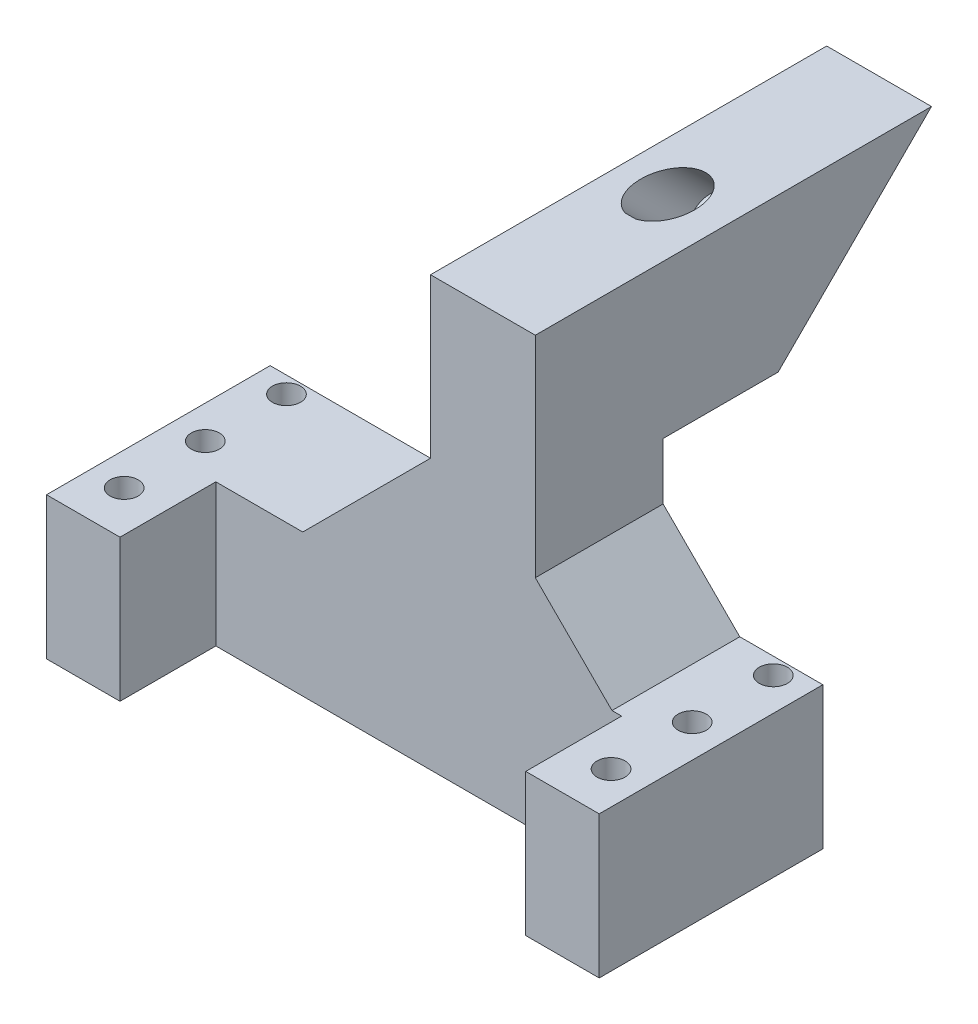
ISO-10303-21;
HEADER;
FILE_DESCRIPTION(('STEP AP214'),'2;1');
FILE_NAME('part.step','',(''),(''),'','','');
FILE_SCHEMA(('AUTOMOTIVE_DESIGN { 1 0 10303 214 1 1 1 1 }'));
ENDSEC;
DATA;
#1=APPLICATION_CONTEXT('core data for automotive mechanical design processes');
#2=APPLICATION_PROTOCOL_DEFINITION('international standard','automotive_design',2000,#1);
#3=PRODUCT_CONTEXT('',#1,'mechanical');
#4=PRODUCT('Part','Part','',(#3));
#5=PRODUCT_RELATED_PRODUCT_CATEGORY('part','',(#4));
#6=PRODUCT_DEFINITION_FORMATION('','',#4);
#7=PRODUCT_DEFINITION_CONTEXT('part definition',#1,'design');
#8=PRODUCT_DEFINITION('design','',#6,#7);
#9=PRODUCT_DEFINITION_SHAPE('','',#8);
#10=(LENGTH_UNIT() NAMED_UNIT(*) SI_UNIT(.MILLI.,.METRE.));
#11=(NAMED_UNIT(*) PLANE_ANGLE_UNIT() SI_UNIT($,.RADIAN.));
#12=(NAMED_UNIT(*) SI_UNIT($,.STERADIAN.) SOLID_ANGLE_UNIT());
#13=UNCERTAINTY_MEASURE_WITH_UNIT(LENGTH_MEASURE(1.E-05),#10,'distance_accuracy_value','');
#14=(GEOMETRIC_REPRESENTATION_CONTEXT(3) GLOBAL_UNCERTAINTY_ASSIGNED_CONTEXT((#13)) GLOBAL_UNIT_ASSIGNED_CONTEXT((#10,
#11,#12)) REPRESENTATION_CONTEXT('',''));
#15=CARTESIAN_POINT('',(0.,0.,0.));
#16=DIRECTION('',(0.,0.,1.));
#17=DIRECTION('',(1.,0.,0.));
#18=AXIS2_PLACEMENT_3D('',#15,#16,#17);
#19=CARTESIAN_POINT('',(52.7780874881676,78.2150216048556,-4.72002160485578));
#20=DIRECTION('',(0.,-0.707106781186551,-0.707106781186544));
#21=DIRECTION('',(0.,0.707106781186544,-0.707106781186551));
#22=AXIS2_PLACEMENT_3D('',#19,#20,#21);
#23=CYLINDRICAL_SURFACE('',#22,2.35);
#24=CARTESIAN_POINT('',(52.7780874881676,39.7150216048555,-43.2200216048555));
#25=DIRECTION('',(0.,-0.707106781186551,-0.707106781186544));
#26=DIRECTION('',(0.,0.707106781186544,-0.707106781186551));
#27=AXIS2_PLACEMENT_3D('',#24,#25,#26);
#28=CIRCLE('',#27,2.35);
#29=CARTESIAN_POINT('',(52.7780874881676,41.3767225406438,-44.8817225406439));
#30=VERTEX_POINT('',#29);
#31=EDGE_CURVE('E190',#30,#30,#28,.T.);
#32=ORIENTED_EDGE('',*,*,#31,.T.);
#33=EDGE_LOOP('',(#32));
#34=FACE_BOUND('',#33,.T.);
#35=CARTESIAN_POINT('',(52.7780874881676,47.6035238597932,-35.3315193499179));
#36=DIRECTION('',(0.,0.707106781186546,0.707106781186549));
#37=DIRECTION('',(0.,-0.707106781186549,0.707106781186546));
#38=AXIS2_PLACEMENT_3D('',#35,#36,#37);
#39=CIRCLE('',#38,2.35);
#40=CARTESIAN_POINT('',(52.7780874881676,45.9418229240048,-33.6698184141295));
#41=VERTEX_POINT('',#40);
#42=EDGE_CURVE('E194',#41,#41,#39,.F.);
#43=ORIENTED_EDGE('',*,*,#42,.F.);
#44=EDGE_LOOP('',(#43));
#45=FACE_BOUND('',#44,.T.);
#46=ADVANCED_FACE('F32',(#34,#45),#23,.F.);
#47=CARTESIAN_POINT('',(11.5,-11.125,-17.5));
#48=DIRECTION('',(0.,0.,1.));
#49=DIRECTION('',(1.,0.,0.));
#50=AXIS2_PLACEMENT_3D('',#47,#48,#49);
#51=PLANE('',#50);
#52=DIRECTION('',(-1.,0.,0.));
#53=VECTOR('',#52,1.);
#54=CARTESIAN_POINT('',(61.5,31.995,-17.5));
#55=LINE('',#54,#53);
#56=CARTESIAN_POINT('',(61.5,31.995,-17.5));
#57=VERTEX_POINT('',#56);
#58=CARTESIAN_POINT('',(45.1,31.995,-17.5));
#59=VERTEX_POINT('',#58);
#60=EDGE_CURVE('E54',#57,#59,#55,.T.);
#61=ORIENTED_EDGE('',*,*,#60,.F.);
#62=DIRECTION('',(0.,1.,0.));
#63=VECTOR('',#62,1.);
#64=CARTESIAN_POINT('',(61.5,-11.125,-17.5));
#65=LINE('',#64,#63);
#66=CARTESIAN_POINT('',(61.5,23.125,-17.5));
#67=VERTEX_POINT('',#66);
#68=EDGE_CURVE('E266',#67,#57,#65,.T.);
#69=ORIENTED_EDGE('',*,*,#68,.F.);
#70=DIRECTION('',(0.707106781186552,-0.707106781186543,0.));
#71=VECTOR('',#70,1.);
#72=CARTESIAN_POINT('',(53.6249999999997,31.0000000000002,-17.5));
#73=LINE('',#72,#71);
#74=CARTESIAN_POINT('',(73.5000000000001,11.125,-17.5));
#75=VERTEX_POINT('',#74);
#76=EDGE_CURVE('E152',#67,#75,#73,.T.);
#77=ORIENTED_EDGE('',*,*,#76,.T.);
#78=DIRECTION('',(-1.,0.,0.));
#79=VECTOR('',#78,1.);
#80=CARTESIAN_POINT('',(76.5,11.125,-17.5));
#81=LINE('',#80,#79);
#82=CARTESIAN_POINT('',(86.5,11.125,-17.5));
#83=VERTEX_POINT('',#82);
#84=EDGE_CURVE('E176',#83,#75,#81,.T.);
#85=ORIENTED_EDGE('',*,*,#84,.F.);
#86=DIRECTION('',(0.,1.,0.));
#87=VECTOR('',#86,1.);
#88=CARTESIAN_POINT('',(86.5,-11.125,-17.5));
#89=LINE('',#88,#87);
#90=CARTESIAN_POINT('',(86.5,-11.125,-17.5));
#91=VERTEX_POINT('',#90);
#92=EDGE_CURVE('E214',#91,#83,#89,.T.);
#93=ORIENTED_EDGE('',*,*,#92,.F.);
#94=DIRECTION('',(-1.,0.,0.));
#95=VECTOR('',#94,1.);
#96=CARTESIAN_POINT('',(11.5,-11.125,-17.5));
#97=LINE('',#96,#95);
#98=CARTESIAN_POINT('',(0.,-11.125,-17.5));
#99=VERTEX_POINT('',#98);
#100=EDGE_CURVE('E295',#91,#99,#97,.T.);
#101=ORIENTED_EDGE('',*,*,#100,.T.);
#102=DIRECTION('',(0.,1.,0.));
#103=VECTOR('',#102,1.);
#104=CARTESIAN_POINT('',(0.,-11.125,-17.5));
#105=LINE('',#104,#103);
#106=CARTESIAN_POINT('',(0.,11.125,-17.5));
#107=VERTEX_POINT('',#106);
#108=EDGE_CURVE('E284',#99,#107,#105,.T.);
#109=ORIENTED_EDGE('',*,*,#108,.T.);
#110=DIRECTION('',(-1.,0.,0.));
#111=VECTOR('',#110,1.);
#112=CARTESIAN_POINT('',(11.5,11.125,-17.5));
#113=LINE('',#112,#111);
#114=CARTESIAN_POINT('',(25.1000000000001,11.125,-17.5));
#115=VERTEX_POINT('',#114);
#116=EDGE_CURVE('E311',#115,#107,#113,.T.);
#117=ORIENTED_EDGE('',*,*,#116,.F.);
#118=DIRECTION('',(-0.707106781186544,-0.707106781186551,0.));
#119=VECTOR('',#118,1.);
#120=CARTESIAN_POINT('',(7.17500000000012,-6.80000000000017,-17.5));
#121=LINE('',#120,#119);
#122=CARTESIAN_POINT('',(45.1,31.1250000000001,-17.5));
#123=VERTEX_POINT('',#122);
#124=EDGE_CURVE('E326',#115,#123,#121,.F.);
#125=ORIENTED_EDGE('',*,*,#124,.T.);
#126=DIRECTION('',(0.,-1.,0.));
#127=VECTOR('',#126,1.);
#128=CARTESIAN_POINT('',(45.1,55.995,-17.5));
#129=LINE('',#128,#127);
#130=EDGE_CURVE('E261',#59,#123,#129,.T.);
#131=ORIENTED_EDGE('',*,*,#130,.F.);
#132=EDGE_LOOP('',(#61,#69,#77,#85,#93,#101,#109,#117,#125,#131));
#133=FACE_BOUND('',#132,.T.);
#134=ADVANCED_FACE('F358',(#133),#51,.F.);
#135=CARTESIAN_POINT('',(61.5,11.125,2.5));
#136=DIRECTION('',(0.,0.,-1.));
#137=DIRECTION('',(0.,1.,0.));
#138=AXIS2_PLACEMENT_3D('',#135,#136,#137);
#139=PLANE('',#138);
#140=DIRECTION('',(0.,-1.,0.));
#141=VECTOR('',#140,1.);
#142=CARTESIAN_POINT('',(75.,11.125,2.5));
#143=LINE('',#142,#141);
#144=CARTESIAN_POINT('',(75.,11.125,2.5));
#145=VERTEX_POINT('',#144);
#146=CARTESIAN_POINT('',(75.,-11.125,2.5));
#147=VERTEX_POINT('',#146);
#148=EDGE_CURVE('E248',#145,#147,#143,.T.);
#149=ORIENTED_EDGE('',*,*,#148,.F.);
#150=DIRECTION('',(-1.,0.,0.));
#151=VECTOR('',#150,1.);
#152=CARTESIAN_POINT('',(76.5,11.125,2.5));
#153=LINE('',#152,#151);
#154=CARTESIAN_POINT('',(73.5000000000001,11.125,2.5));
#155=VERTEX_POINT('',#154);
#156=EDGE_CURVE('E251',#145,#155,#153,.T.);
#157=ORIENTED_EDGE('',*,*,#156,.T.);
#158=DIRECTION('',(-0.707106781186552,0.707106781186543,0.));
#159=VECTOR('',#158,1.);
#160=CARTESIAN_POINT('',(67.5,17.125,2.5));
#161=LINE('',#160,#159);
#162=CARTESIAN_POINT('',(61.5,23.125,2.5));
#163=VERTEX_POINT('',#162);
#164=EDGE_CURVE('E334',#155,#163,#161,.T.);
#165=ORIENTED_EDGE('',*,*,#164,.T.);
#166=DIRECTION('',(0.,-1.,0.));
#167=VECTOR('',#166,1.);
#168=CARTESIAN_POINT('',(61.5,11.125,2.5));
#169=LINE('',#168,#167);
#170=CARTESIAN_POINT('',(61.5,55.995,2.5));
#171=VERTEX_POINT('',#170);
#172=EDGE_CURVE('E264',#171,#163,#169,.T.);
#173=ORIENTED_EDGE('',*,*,#172,.F.);
#174=DIRECTION('',(1.,0.,0.));
#175=VECTOR('',#174,1.);
#176=CARTESIAN_POINT('',(45.1,55.995,2.5));
#177=LINE('',#176,#175);
#178=CARTESIAN_POINT('',(45.1,55.995,2.5));
#179=VERTEX_POINT('',#178);
#180=EDGE_CURVE('E171',#179,#171,#177,.T.);
#181=ORIENTED_EDGE('',*,*,#180,.F.);
#182=DIRECTION('',(0.,-1.,0.));
#183=VECTOR('',#182,1.);
#184=CARTESIAN_POINT('',(45.1,55.995,2.5));
#185=LINE('',#184,#183);
#186=CARTESIAN_POINT('',(45.1,31.1250000000001,2.5));
#187=VERTEX_POINT('',#186);
#188=EDGE_CURVE('E258',#179,#187,#185,.T.);
#189=ORIENTED_EDGE('',*,*,#188,.T.);
#190=DIRECTION('',(0.707106781186544,0.707106781186551,0.));
#191=VECTOR('',#190,1.);
#192=CARTESIAN_POINT('',(43.2999999999998,29.325,2.5));
#193=LINE('',#192,#191);
#194=CARTESIAN_POINT('',(25.1000000000001,11.125,2.5));
#195=VERTEX_POINT('',#194);
#196=EDGE_CURVE('E324',#187,#195,#193,.F.);
#197=ORIENTED_EDGE('',*,*,#196,.T.);
#198=DIRECTION('',(-1.,0.,0.));
#199=VECTOR('',#198,1.);
#200=CARTESIAN_POINT('',(61.5,11.125,2.5));
#201=LINE('',#200,#199);
#202=CARTESIAN_POINT('',(11.5,11.125,2.5));
#203=VERTEX_POINT('',#202);
#204=EDGE_CURVE('E272',#195,#203,#201,.T.);
#205=ORIENTED_EDGE('',*,*,#204,.T.);
#206=DIRECTION('',(0.,-1.,0.));
#207=VECTOR('',#206,1.);
#208=CARTESIAN_POINT('',(11.5,11.125,2.5));
#209=LINE('',#208,#207);
#210=CARTESIAN_POINT('',(11.5,-11.125,2.5));
#211=VERTEX_POINT('',#210);
#212=EDGE_CURVE('E263',#203,#211,#209,.T.);
#213=ORIENTED_EDGE('',*,*,#212,.T.);
#214=DIRECTION('',(-1.,0.,0.));
#215=VECTOR('',#214,1.);
#216=CARTESIAN_POINT('',(61.5,-11.125,2.5));
#217=LINE('',#216,#215);
#218=EDGE_CURVE('E268',#147,#211,#217,.T.);
#219=ORIENTED_EDGE('',*,*,#218,.F.);
#220=EDGE_LOOP('',(#149,#157,#165,#173,#181,#189,#197,#205,#213,#219));
#221=FACE_BOUND('',#220,.T.);
#222=ADVANCED_FACE('F363',(#221),#139,.F.);
#223=CARTESIAN_POINT('',(11.5,11.125,17.5));
#224=DIRECTION('',(0.,-1.,0.));
#225=DIRECTION('',(0.,0.,-1.));
#226=AXIS2_PLACEMENT_3D('',#223,#224,#225);
#227=PLANE('',#226);
#228=CARTESIAN_POINT('',(5.15,11.125,-14.9));
#229=DIRECTION('',(0.,1.,0.));
#230=DIRECTION('',(0.,0.,1.));
#231=AXIS2_PLACEMENT_3D('',#228,#229,#230);
#232=CIRCLE('',#231,2.2);
#233=CARTESIAN_POINT('',(5.15,11.125,-12.7));
#234=VERTEX_POINT('',#233);
#235=EDGE_CURVE('E316',#234,#234,#232,.T.);
#236=ORIENTED_EDGE('',*,*,#235,.F.);
#237=EDGE_LOOP('',(#236));
#238=FACE_BOUND('',#237,.T.);
#239=CARTESIAN_POINT('',(5.15,11.125,10.5));
#240=DIRECTION('',(0.,1.,0.));
#241=DIRECTION('',(0.,0.,1.));
#242=AXIS2_PLACEMENT_3D('',#239,#240,#241);
#243=CIRCLE('',#242,2.2);
#244=CARTESIAN_POINT('',(5.15,11.125,12.7));
#245=VERTEX_POINT('',#244);
#246=EDGE_CURVE('E280',#245,#245,#243,.T.);
#247=ORIENTED_EDGE('',*,*,#246,.F.);
#248=EDGE_LOOP('',(#247));
#249=FACE_BOUND('',#248,.T.);
#250=CARTESIAN_POINT('',(5.15,11.125,-2.2));
#251=DIRECTION('',(0.,1.,0.));
#252=DIRECTION('',(0.,0.,1.));
#253=AXIS2_PLACEMENT_3D('',#250,#251,#252);
#254=CIRCLE('',#253,2.2);
#255=CARTESIAN_POINT('',(5.15,11.125,0.));
#256=VERTEX_POINT('',#255);
#257=EDGE_CURVE('E277',#256,#256,#254,.T.);
#258=ORIENTED_EDGE('',*,*,#257,.F.);
#259=EDGE_LOOP('',(#258));
#260=FACE_BOUND('',#259,.T.);
#261=ORIENTED_EDGE('',*,*,#204,.F.);
#262=DIRECTION('',(0.,0.,-1.));
#263=VECTOR('',#262,1.);
#264=CARTESIAN_POINT('',(25.1000000000001,11.125,-17.5));
#265=LINE('',#264,#263);
#266=EDGE_CURVE('E322',#195,#115,#265,.T.);
#267=ORIENTED_EDGE('',*,*,#266,.T.);
#268=ORIENTED_EDGE('',*,*,#116,.T.);
#269=DIRECTION('',(0.,0.,1.));
#270=VECTOR('',#269,1.);
#271=CARTESIAN_POINT('',(0.,11.125,17.5));
#272=LINE('',#271,#270);
#273=CARTESIAN_POINT('',(0.,11.125,17.5));
#274=VERTEX_POINT('',#273);
#275=EDGE_CURVE('E298',#107,#274,#272,.T.);
#276=ORIENTED_EDGE('',*,*,#275,.T.);
#277=DIRECTION('',(-1.,0.,0.));
#278=VECTOR('',#277,1.);
#279=CARTESIAN_POINT('',(11.5,11.125,17.5));
#280=LINE('',#279,#278);
#281=CARTESIAN_POINT('',(11.5,11.125,17.5));
#282=VERTEX_POINT('',#281);
#283=EDGE_CURVE('E308',#282,#274,#280,.T.);
#284=ORIENTED_EDGE('',*,*,#283,.F.);
#285=DIRECTION('',(0.,0.,1.));
#286=VECTOR('',#285,1.);
#287=CARTESIAN_POINT('',(11.5,11.125,17.5));
#288=LINE('',#287,#286);
#289=EDGE_CURVE('E287',#203,#282,#288,.T.);
#290=ORIENTED_EDGE('',*,*,#289,.F.);
#291=EDGE_LOOP('',(#261,#267,#268,#276,#284,#290));
#292=FACE_BOUND('',#291,.T.);
#293=ADVANCED_FACE('F406',(#238,#249,#260,#292),#227,.F.);
#294=CARTESIAN_POINT('',(11.5,0.,0.));
#295=DIRECTION('',(-1.,0.,0.));
#296=DIRECTION('',(0.,0.,1.));
#297=AXIS2_PLACEMENT_3D('',#294,#295,#296);
#298=PLANE('',#297);
#299=ORIENTED_EDGE('',*,*,#212,.F.);
#300=ORIENTED_EDGE('',*,*,#289,.T.);
#301=DIRECTION('',(0.,-1.,0.));
#302=VECTOR('',#301,1.);
#303=CARTESIAN_POINT('',(11.5,-11.125,17.5));
#304=LINE('',#303,#302);
#305=CARTESIAN_POINT('',(11.5,-11.125,17.5));
#306=VERTEX_POINT('',#305);
#307=EDGE_CURVE('E289',#282,#306,#304,.T.);
#308=ORIENTED_EDGE('',*,*,#307,.T.);
#309=DIRECTION('',(0.,0.,-1.));
#310=VECTOR('',#309,1.);
#311=CARTESIAN_POINT('',(11.5,-11.125,17.5));
#312=LINE('',#311,#310);
#313=EDGE_CURVE('E292',#306,#211,#312,.T.);
#314=ORIENTED_EDGE('',*,*,#313,.T.);
#315=EDGE_LOOP('',(#299,#300,#308,#314));
#316=FACE_BOUND('',#315,.T.);
#317=ADVANCED_FACE('F416',(#316),#298,.F.);
#318=CARTESIAN_POINT('',(5.15,-11.125,-14.9));
#319=DIRECTION('',(0.,1.,0.));
#320=DIRECTION('',(0.,0.,1.));
#321=AXIS2_PLACEMENT_3D('',#318,#319,#320);
#322=CYLINDRICAL_SURFACE('',#321,2.2);
#323=CARTESIAN_POINT('',(5.15,-11.125,-14.9));
#324=DIRECTION('',(0.,1.,0.));
#325=DIRECTION('',(0.,0.,1.));
#326=AXIS2_PLACEMENT_3D('',#323,#324,#325);
#327=CIRCLE('',#326,2.2);
#328=CARTESIAN_POINT('',(5.15,-11.125,-12.7));
#329=VERTEX_POINT('',#328);
#330=EDGE_CURVE('E313',#329,#329,#327,.T.);
#331=ORIENTED_EDGE('',*,*,#330,.F.);
#332=EDGE_LOOP('',(#331));
#333=FACE_BOUND('',#332,.T.);
#334=ORIENTED_EDGE('',*,*,#235,.T.);
#335=EDGE_LOOP('',(#334));
#336=FACE_BOUND('',#335,.T.);
#337=ADVANCED_FACE('F419',(#333,#336),#322,.F.);
#338=CARTESIAN_POINT('',(11.5,-11.125,17.5));
#339=DIRECTION('',(0.,0.,-1.));
#340=DIRECTION('',(-1.,0.,0.));
#341=AXIS2_PLACEMENT_3D('',#338,#339,#340);
#342=PLANE('',#341);
#343=DIRECTION('',(0.,-1.,0.));
#344=VECTOR('',#343,1.);
#345=CARTESIAN_POINT('',(0.,-11.125,17.5));
#346=LINE('',#345,#344);
#347=CARTESIAN_POINT('',(0.,-11.125,17.5));
#348=VERTEX_POINT('',#347);
#349=EDGE_CURVE('E300',#274,#348,#346,.T.);
#350=ORIENTED_EDGE('',*,*,#349,.T.);
#351=DIRECTION('',(-1.,0.,0.));
#352=VECTOR('',#351,1.);
#353=CARTESIAN_POINT('',(11.5,-11.125,17.5));
#354=LINE('',#353,#352);
#355=EDGE_CURVE('E305',#306,#348,#354,.T.);
#356=ORIENTED_EDGE('',*,*,#355,.F.);
#357=ORIENTED_EDGE('',*,*,#307,.F.);
#358=ORIENTED_EDGE('',*,*,#283,.T.);
#359=EDGE_LOOP('',(#350,#356,#357,#358));
#360=FACE_BOUND('',#359,.T.);
#361=ADVANCED_FACE('F427',(#360),#342,.F.);
#362=CARTESIAN_POINT('',(11.5,-11.125,17.5));
#363=DIRECTION('',(0.,1.,0.));
#364=DIRECTION('',(0.,0.,1.));
#365=AXIS2_PLACEMENT_3D('',#362,#363,#364);
#366=PLANE('',#365);
#367=DIRECTION('',(0.,0.,-1.));
#368=VECTOR('',#367,1.);
#369=CARTESIAN_POINT('',(75.,-11.125,17.5));
#370=LINE('',#369,#368);
#371=CARTESIAN_POINT('',(75.,-11.125,17.5));
#372=VERTEX_POINT('',#371);
#373=EDGE_CURVE('E223',#372,#147,#370,.T.);
#374=ORIENTED_EDGE('',*,*,#373,.T.);
#375=ORIENTED_EDGE('',*,*,#218,.T.);
#376=ORIENTED_EDGE('',*,*,#313,.F.);
#377=ORIENTED_EDGE('',*,*,#355,.T.);
#378=DIRECTION('',(0.,0.,-1.));
#379=VECTOR('',#378,1.);
#380=CARTESIAN_POINT('',(0.,-11.125,17.5));
#381=LINE('',#380,#379);
#382=EDGE_CURVE('E290',#348,#99,#381,.T.);
#383=ORIENTED_EDGE('',*,*,#382,.T.);
#384=ORIENTED_EDGE('',*,*,#100,.F.);
#385=DIRECTION('',(0.,0.,-1.));
#386=VECTOR('',#385,1.);
#387=CARTESIAN_POINT('',(86.5,-11.125,17.5));
#388=LINE('',#387,#386);
#389=CARTESIAN_POINT('',(86.5,-11.125,17.5));
#390=VERTEX_POINT('',#389);
#391=EDGE_CURVE('E220',#390,#91,#388,.T.);
#392=ORIENTED_EDGE('',*,*,#391,.F.);
#393=DIRECTION('',(1.,0.,0.));
#394=VECTOR('',#393,1.);
#395=CARTESIAN_POINT('',(75.,-11.125,17.5));
#396=LINE('',#395,#394);
#397=EDGE_CURVE('E226',#372,#390,#396,.T.);
#398=ORIENTED_EDGE('',*,*,#397,.F.);
#399=EDGE_LOOP('',(#374,#375,#376,#377,#383,#384,#392,#398));
#400=FACE_BOUND('',#399,.T.);
#401=CARTESIAN_POINT('',(81.35,-11.125,-2.2));
#402=DIRECTION('',(0.,-1.,0.));
#403=DIRECTION('',(0.,0.,1.));
#404=AXIS2_PLACEMENT_3D('',#401,#402,#403);
#405=CIRCLE('',#404,2.2);
#406=CARTESIAN_POINT('',(81.35,-11.125,0.));
#407=VERTEX_POINT('',#406);
#408=EDGE_CURVE('E204',#407,#407,#405,.T.);
#409=ORIENTED_EDGE('',*,*,#408,.F.);
#410=EDGE_LOOP('',(#409));
#411=FACE_BOUND('',#410,.T.);
#412=CARTESIAN_POINT('',(81.35,-11.125,10.5));
#413=DIRECTION('',(0.,-1.,0.));
#414=DIRECTION('',(0.,0.,1.));
#415=AXIS2_PLACEMENT_3D('',#412,#413,#414);
#416=CIRCLE('',#415,2.2);
#417=CARTESIAN_POINT('',(81.35,-11.125,12.7));
#418=VERTEX_POINT('',#417);
#419=EDGE_CURVE('E211',#418,#418,#416,.T.);
#420=ORIENTED_EDGE('',*,*,#419,.F.);
#421=EDGE_LOOP('',(#420));
#422=FACE_BOUND('',#421,.T.);
#423=CARTESIAN_POINT('',(81.35,-11.125,-14.9));
#424=DIRECTION('',(0.,-1.,0.));
#425=DIRECTION('',(0.,0.,1.));
#426=AXIS2_PLACEMENT_3D('',#423,#424,#425);
#427=CIRCLE('',#426,2.2);
#428=CARTESIAN_POINT('',(81.35,-11.125,-12.7));
#429=VERTEX_POINT('',#428);
#430=EDGE_CURVE('E242',#429,#429,#427,.T.);
#431=ORIENTED_EDGE('',*,*,#430,.F.);
#432=EDGE_LOOP('',(#431));
#433=FACE_BOUND('',#432,.T.);
#434=ORIENTED_EDGE('',*,*,#330,.T.);
#435=EDGE_LOOP('',(#434));
#436=FACE_BOUND('',#435,.T.);
#437=CARTESIAN_POINT('',(5.15,-11.125,10.5));
#438=DIRECTION('',(0.,1.,0.));
#439=DIRECTION('',(0.,0.,1.));
#440=AXIS2_PLACEMENT_3D('',#437,#438,#439);
#441=CIRCLE('',#440,2.2);
#442=CARTESIAN_POINT('',(5.15,-11.125,12.7));
#443=VERTEX_POINT('',#442);
#444=EDGE_CURVE('E281',#443,#443,#441,.T.);
#445=ORIENTED_EDGE('',*,*,#444,.T.);
#446=EDGE_LOOP('',(#445));
#447=FACE_BOUND('',#446,.T.);
#448=CARTESIAN_POINT('',(5.15,-11.125,-2.2));
#449=DIRECTION('',(0.,1.,0.));
#450=DIRECTION('',(0.,0.,1.));
#451=AXIS2_PLACEMENT_3D('',#448,#449,#450);
#452=CIRCLE('',#451,2.2);
#453=CARTESIAN_POINT('',(5.15,-11.125,0.));
#454=VERTEX_POINT('',#453);
#455=EDGE_CURVE('E274',#454,#454,#452,.T.);
#456=ORIENTED_EDGE('',*,*,#455,.T.);
#457=EDGE_LOOP('',(#456));
#458=FACE_BOUND('',#457,.T.);
#459=ADVANCED_FACE('F423',(#400,#411,#422,#433,#436,#447,#458),#366,.F.);
#460=CARTESIAN_POINT('',(0.,0.,0.));
#461=DIRECTION('',(-1.,0.,0.));
#462=DIRECTION('',(0.,0.,1.));
#463=AXIS2_PLACEMENT_3D('',#460,#461,#462);
#464=PLANE('',#463);
#465=ORIENTED_EDGE('',*,*,#108,.F.);
#466=ORIENTED_EDGE('',*,*,#382,.F.);
#467=ORIENTED_EDGE('',*,*,#349,.F.);
#468=ORIENTED_EDGE('',*,*,#275,.F.);
#469=EDGE_LOOP('',(#465,#466,#467,#468));
#470=FACE_BOUND('',#469,.T.);
#471=ADVANCED_FACE('F414',(#470),#464,.T.);
#472=CARTESIAN_POINT('',(5.15,-11.125,10.5));
#473=DIRECTION('',(0.,1.,0.));
#474=DIRECTION('',(0.,0.,1.));
#475=AXIS2_PLACEMENT_3D('',#472,#473,#474);
#476=CYLINDRICAL_SURFACE('',#475,2.2);
#477=ORIENTED_EDGE('',*,*,#444,.F.);
#478=EDGE_LOOP('',(#477));
#479=FACE_BOUND('',#478,.T.);
#480=ORIENTED_EDGE('',*,*,#246,.T.);
#481=EDGE_LOOP('',(#480));
#482=FACE_BOUND('',#481,.T.);
#483=ADVANCED_FACE('F410',(#479,#482),#476,.F.);
#484=CARTESIAN_POINT('',(5.15,-11.125,-2.2));
#485=DIRECTION('',(0.,1.,0.));
#486=DIRECTION('',(0.,0.,1.));
#487=AXIS2_PLACEMENT_3D('',#484,#485,#486);
#488=CYLINDRICAL_SURFACE('',#487,2.2);
#489=ORIENTED_EDGE('',*,*,#455,.F.);
#490=EDGE_LOOP('',(#489));
#491=FACE_BOUND('',#490,.T.);
#492=ORIENTED_EDGE('',*,*,#257,.T.);
#493=EDGE_LOOP('',(#492));
#494=FACE_BOUND('',#493,.T.);
#495=ADVANCED_FACE('F403',(#491,#494),#488,.F.);
#496=CARTESIAN_POINT('',(61.5,0.,0.));
#497=DIRECTION('',(1.,0.,0.));
#498=DIRECTION('',(0.,0.,-1.));
#499=AXIS2_PLACEMENT_3D('',#496,#497,#498);
#500=PLANE('',#499);
#501=ORIENTED_EDGE('',*,*,#172,.T.);
#502=DIRECTION('',(0.,0.,-1.));
#503=VECTOR('',#502,1.);
#504=CARTESIAN_POINT('',(61.5,23.125,0.));
#505=LINE('',#504,#503);
#506=EDGE_CURVE('E332',#163,#67,#505,.T.);
#507=ORIENTED_EDGE('',*,*,#506,.T.);
#508=ORIENTED_EDGE('',*,*,#68,.T.);
#509=DIRECTION('',(0.,0.,1.));
#510=VECTOR('',#509,1.);
#511=CARTESIAN_POINT('',(61.5,31.995,-35.5));
#512=LINE('',#511,#510);
#513=CARTESIAN_POINT('',(61.5,31.995,-35.5));
#514=VERTEX_POINT('',#513);
#515=EDGE_CURVE('E189',#514,#57,#512,.T.);
#516=ORIENTED_EDGE('',*,*,#515,.F.);
#517=DIRECTION('',(0.,0.707106781186544,-0.707106781186551));
#518=VECTOR('',#517,1.);
#519=CARTESIAN_POINT('',(61.5,31.995,-35.5));
#520=LINE('',#519,#518);
#521=CARTESIAN_POINT('',(61.5,55.995,-59.5000000000002));
#522=VERTEX_POINT('',#521);
#523=EDGE_CURVE('E182',#514,#522,#520,.T.);
#524=ORIENTED_EDGE('',*,*,#523,.T.);
#525=DIRECTION('',(0.,0.,-1.));
#526=VECTOR('',#525,1.);
#527=CARTESIAN_POINT('',(61.5,55.995,2.5));
#528=LINE('',#527,#526);
#529=EDGE_CURVE('E166',#171,#522,#528,.T.);
#530=ORIENTED_EDGE('',*,*,#529,.F.);
#531=EDGE_LOOP('',(#501,#507,#508,#516,#524,#530));
#532=FACE_BOUND('',#531,.T.);
#533=ADVANCED_FACE('F187',(#532),#500,.T.);
#534=CARTESIAN_POINT('',(45.1,55.995,2.5));
#535=DIRECTION('',(1.,0.,0.));
#536=DIRECTION('',(0.,0.,-1.));
#537=AXIS2_PLACEMENT_3D('',#534,#535,#536);
#538=PLANE('',#537);
#539=DIRECTION('',(0.,0.,1.));
#540=VECTOR('',#539,1.);
#541=CARTESIAN_POINT('',(45.1,55.995,2.5));
#542=LINE('',#541,#540);
#543=CARTESIAN_POINT('',(45.1,55.995,-59.5000000000002));
#544=VERTEX_POINT('',#543);
#545=EDGE_CURVE('E175',#544,#179,#542,.T.);
#546=ORIENTED_EDGE('',*,*,#545,.F.);
#547=DIRECTION('',(0.,0.707106781186544,-0.707106781186551));
#548=VECTOR('',#547,1.);
#549=CARTESIAN_POINT('',(45.1,31.995,-35.5));
#550=LINE('',#549,#548);
#551=CARTESIAN_POINT('',(45.1,31.995,-35.5));
#552=VERTEX_POINT('',#551);
#553=EDGE_CURVE('E184',#552,#544,#550,.T.);
#554=ORIENTED_EDGE('',*,*,#553,.F.);
#555=DIRECTION('',(0.,0.,1.));
#556=VECTOR('',#555,1.);
#557=CARTESIAN_POINT('',(45.1,31.995,-35.5));
#558=LINE('',#557,#556);
#559=EDGE_CURVE('E199',#552,#59,#558,.T.);
#560=ORIENTED_EDGE('',*,*,#559,.T.);
#561=ORIENTED_EDGE('',*,*,#130,.T.);
#562=DIRECTION('',(0.,0.,1.));
#563=VECTOR('',#562,1.);
#564=CARTESIAN_POINT('',(45.1,31.1250000000001,2.5));
#565=LINE('',#564,#563);
#566=EDGE_CURVE('E319',#123,#187,#565,.T.);
#567=ORIENTED_EDGE('',*,*,#566,.T.);
#568=ORIENTED_EDGE('',*,*,#188,.F.);
#569=EDGE_LOOP('',(#546,#554,#560,#561,#567,#568));
#570=FACE_BOUND('',#569,.T.);
#571=ADVANCED_FACE('F161',(#570),#538,.F.);
#572=CARTESIAN_POINT('',(0.,55.995,0.));
#573=DIRECTION('',(0.,-1.,0.));
#574=DIRECTION('',(0.,0.,-1.));
#575=AXIS2_PLACEMENT_3D('',#572,#573,#574);
#576=PLANE('',#575);
#577=DIRECTION('',(-1.,0.,0.));
#578=VECTOR('',#577,1.);
#579=CARTESIAN_POINT('',(0.,55.995,-21.0955784921551));
#580=LINE('',#579,#578);
#581=CARTESIAN_POINT('',(53.5271643084105,55.995,-21.0955784921551));
#582=VERTEX_POINT('',#581);
#583=CARTESIAN_POINT('',(52.0290106679247,55.995,-21.0955784921551));
#584=VERTEX_POINT('',#583);
#585=EDGE_CURVE('E40',#582,#584,#580,.T.);
#586=ORIENTED_EDGE('',*,*,#585,.T.);
#587=CARTESIAN_POINT('',(52.7780874881676,55.995,-26.9400432097105));
#588=DIRECTION('',(0.,-1.,0.));
#589=DIRECTION('',(0.,0.,1.));
#590=AXIS2_PLACEMENT_3D('',#587,#588,#589);
#591=ELLIPSE('',#590,5.93969696196701,4.2);
#592=EDGE_CURVE('E11',#584,#582,#591,.T.);
#593=ORIENTED_EDGE('',*,*,#592,.T.);
#594=EDGE_LOOP('',(#586,#593));
#595=FACE_BOUND('',#594,.T.);
#596=ORIENTED_EDGE('',*,*,#529,.T.);
#597=DIRECTION('',(1.,0.,0.));
#598=VECTOR('',#597,1.);
#599=CARTESIAN_POINT('',(45.1,55.995,-59.5000000000002));
#600=LINE('',#599,#598);
#601=EDGE_CURVE('E168',#544,#522,#600,.T.);
#602=ORIENTED_EDGE('',*,*,#601,.F.);
#603=ORIENTED_EDGE('',*,*,#545,.T.);
#604=ORIENTED_EDGE('',*,*,#180,.T.);
#605=EDGE_LOOP('',(#596,#602,#603,#604));
#606=FACE_BOUND('',#605,.T.);
#607=ADVANCED_FACE('F157',(#595,#606),#576,.F.);
#608=CARTESIAN_POINT('',(45.1,31.1250000000001,2.5));
#609=DIRECTION('',(-0.707106781186551,0.707106781186544,0.));
#610=DIRECTION('',(0.,0.,-1.));
#611=AXIS2_PLACEMENT_3D('',#608,#609,#610);
#612=PLANE('',#611);
#613=ORIENTED_EDGE('',*,*,#124,.F.);
#614=ORIENTED_EDGE('',*,*,#266,.F.);
#615=ORIENTED_EDGE('',*,*,#196,.F.);
#616=ORIENTED_EDGE('',*,*,#566,.F.);
#617=EDGE_LOOP('',(#613,#614,#615,#616));
#618=FACE_BOUND('',#617,.T.);
#619=ADVANCED_FACE('F160',(#618),#612,.T.);
#620=CARTESIAN_POINT('',(76.5,11.125,-17.5));
#621=DIRECTION('',(0.,-1.,0.));
#622=DIRECTION('',(0.,0.,-1.));
#623=AXIS2_PLACEMENT_3D('',#620,#621,#622);
#624=PLANE('',#623);
#625=ORIENTED_EDGE('',*,*,#84,.T.);
#626=DIRECTION('',(0.,0.,1.));
#627=VECTOR('',#626,1.);
#628=CARTESIAN_POINT('',(73.5000000000001,11.125,-17.5));
#629=LINE('',#628,#627);
#630=EDGE_CURVE('E329',#75,#155,#629,.T.);
#631=ORIENTED_EDGE('',*,*,#630,.T.);
#632=ORIENTED_EDGE('',*,*,#156,.F.);
#633=DIRECTION('',(0.,0.,1.));
#634=VECTOR('',#633,1.);
#635=CARTESIAN_POINT('',(75.,11.125,17.5));
#636=LINE('',#635,#634);
#637=CARTESIAN_POINT('',(75.,11.125,17.5));
#638=VERTEX_POINT('',#637);
#639=EDGE_CURVE('E217',#145,#638,#636,.T.);
#640=ORIENTED_EDGE('',*,*,#639,.T.);
#641=DIRECTION('',(1.,0.,0.));
#642=VECTOR('',#641,1.);
#643=CARTESIAN_POINT('',(75.,11.125,17.5));
#644=LINE('',#643,#642);
#645=CARTESIAN_POINT('',(86.5,11.125,17.5));
#646=VERTEX_POINT('',#645);
#647=EDGE_CURVE('E239',#638,#646,#644,.T.);
#648=ORIENTED_EDGE('',*,*,#647,.T.);
#649=DIRECTION('',(0.,0.,1.));
#650=VECTOR('',#649,1.);
#651=CARTESIAN_POINT('',(86.5,11.125,17.5));
#652=LINE('',#651,#650);
#653=EDGE_CURVE('E229',#83,#646,#652,.T.);
#654=ORIENTED_EDGE('',*,*,#653,.F.);
#655=EDGE_LOOP('',(#625,#631,#632,#640,#648,#654));
#656=FACE_BOUND('',#655,.T.);
#657=CARTESIAN_POINT('',(81.35,11.125,-2.2));
#658=DIRECTION('',(0.,-1.,0.));
#659=DIRECTION('',(0.,0.,1.));
#660=AXIS2_PLACEMENT_3D('',#657,#658,#659);
#661=CIRCLE('',#660,2.2);
#662=CARTESIAN_POINT('',(81.35,11.125,0.));
#663=VERTEX_POINT('',#662);
#664=EDGE_CURVE('E207',#663,#663,#661,.T.);
#665=ORIENTED_EDGE('',*,*,#664,.T.);
#666=EDGE_LOOP('',(#665));
#667=FACE_BOUND('',#666,.T.);
#668=CARTESIAN_POINT('',(81.35,11.125,10.5));
#669=DIRECTION('',(0.,-1.,0.));
#670=DIRECTION('',(0.,0.,1.));
#671=AXIS2_PLACEMENT_3D('',#668,#669,#670);
#672=CIRCLE('',#671,2.2);
#673=CARTESIAN_POINT('',(81.35,11.125,12.7));
#674=VERTEX_POINT('',#673);
#675=EDGE_CURVE('E210',#674,#674,#672,.T.);
#676=ORIENTED_EDGE('',*,*,#675,.T.);
#677=EDGE_LOOP('',(#676));
#678=FACE_BOUND('',#677,.T.);
#679=CARTESIAN_POINT('',(81.35,11.125,-14.9));
#680=DIRECTION('',(0.,-1.,0.));
#681=DIRECTION('',(0.,0.,1.));
#682=AXIS2_PLACEMENT_3D('',#679,#680,#681);
#683=CIRCLE('',#682,2.2);
#684=CARTESIAN_POINT('',(81.35,11.125,-12.7));
#685=VERTEX_POINT('',#684);
#686=EDGE_CURVE('E245',#685,#685,#683,.T.);
#687=ORIENTED_EDGE('',*,*,#686,.T.);
#688=EDGE_LOOP('',(#687));
#689=FACE_BOUND('',#688,.T.);
#690=ADVANCED_FACE('F383',(#656,#667,#678,#689),#624,.F.);
#691=CARTESIAN_POINT('',(75.,0.,0.));
#692=DIRECTION('',(1.,0.,0.));
#693=DIRECTION('',(0.,0.,1.));
#694=AXIS2_PLACEMENT_3D('',#691,#692,#693);
#695=PLANE('',#694);
#696=ORIENTED_EDGE('',*,*,#639,.F.);
#697=ORIENTED_EDGE('',*,*,#148,.T.);
#698=ORIENTED_EDGE('',*,*,#373,.F.);
#699=DIRECTION('',(0.,-1.,0.));
#700=VECTOR('',#699,1.);
#701=CARTESIAN_POINT('',(75.,-11.125,17.5));
#702=LINE('',#701,#700);
#703=EDGE_CURVE('E219',#638,#372,#702,.T.);
#704=ORIENTED_EDGE('',*,*,#703,.F.);
#705=EDGE_LOOP('',(#696,#697,#698,#704));
#706=FACE_BOUND('',#705,.T.);
#707=ADVANCED_FACE('F379',(#706),#695,.F.);
#708=CARTESIAN_POINT('',(81.35,-11.125,-14.9));
#709=DIRECTION('',(0.,1.,0.));
#710=DIRECTION('',(0.,0.,1.));
#711=AXIS2_PLACEMENT_3D('',#708,#709,#710);
#712=CYLINDRICAL_SURFACE('',#711,2.2);
#713=ORIENTED_EDGE('',*,*,#430,.T.);
#714=EDGE_LOOP('',(#713));
#715=FACE_BOUND('',#714,.T.);
#716=ORIENTED_EDGE('',*,*,#686,.F.);
#717=EDGE_LOOP('',(#716));
#718=FACE_BOUND('',#717,.T.);
#719=ADVANCED_FACE('F382',(#715,#718),#712,.F.);
#720=CARTESIAN_POINT('',(75.,-11.125,17.5));
#721=DIRECTION('',(0.,0.,-1.));
#722=DIRECTION('',(1.,0.,0.));
#723=AXIS2_PLACEMENT_3D('',#720,#721,#722);
#724=PLANE('',#723);
#725=DIRECTION('',(0.,-1.,0.));
#726=VECTOR('',#725,1.);
#727=CARTESIAN_POINT('',(86.5,-11.125,17.5));
#728=LINE('',#727,#726);
#729=EDGE_CURVE('E232',#646,#390,#728,.T.);
#730=ORIENTED_EDGE('',*,*,#729,.F.);
#731=ORIENTED_EDGE('',*,*,#647,.F.);
#732=ORIENTED_EDGE('',*,*,#703,.T.);
#733=ORIENTED_EDGE('',*,*,#397,.T.);
#734=EDGE_LOOP('',(#730,#731,#732,#733));
#735=FACE_BOUND('',#734,.T.);
#736=ADVANCED_FACE('F387',(#735),#724,.F.);
#737=CARTESIAN_POINT('',(86.5,0.,0.));
#738=DIRECTION('',(1.,0.,0.));
#739=DIRECTION('',(0.,0.,1.));
#740=AXIS2_PLACEMENT_3D('',#737,#738,#739);
#741=PLANE('',#740);
#742=ORIENTED_EDGE('',*,*,#92,.T.);
#743=ORIENTED_EDGE('',*,*,#653,.T.);
#744=ORIENTED_EDGE('',*,*,#729,.T.);
#745=ORIENTED_EDGE('',*,*,#391,.T.);
#746=EDGE_LOOP('',(#742,#743,#744,#745));
#747=FACE_BOUND('',#746,.T.);
#748=ADVANCED_FACE('F377',(#747),#741,.T.);
#749=CARTESIAN_POINT('',(81.35,-11.125,10.5));
#750=DIRECTION('',(0.,1.,0.));
#751=DIRECTION('',(0.,0.,1.));
#752=AXIS2_PLACEMENT_3D('',#749,#750,#751);
#753=CYLINDRICAL_SURFACE('',#752,2.2);
#754=ORIENTED_EDGE('',*,*,#419,.T.);
#755=EDGE_LOOP('',(#754));
#756=FACE_BOUND('',#755,.T.);
#757=ORIENTED_EDGE('',*,*,#675,.F.);
#758=EDGE_LOOP('',(#757));
#759=FACE_BOUND('',#758,.T.);
#760=ADVANCED_FACE('F373',(#756,#759),#753,.F.);
#761=CARTESIAN_POINT('',(81.35,-11.125,-2.2));
#762=DIRECTION('',(0.,1.,0.));
#763=DIRECTION('',(0.,0.,1.));
#764=AXIS2_PLACEMENT_3D('',#761,#762,#763);
#765=CYLINDRICAL_SURFACE('',#764,2.2);
#766=ORIENTED_EDGE('',*,*,#408,.T.);
#767=EDGE_LOOP('',(#766));
#768=FACE_BOUND('',#767,.T.);
#769=ORIENTED_EDGE('',*,*,#664,.F.);
#770=EDGE_LOOP('',(#769));
#771=FACE_BOUND('',#770,.T.);
#772=ADVANCED_FACE('F370',(#768,#771),#765,.F.);
#773=CARTESIAN_POINT('',(73.5000000000001,11.125,-17.5));
#774=DIRECTION('',(-0.707106781186543,-0.707106781186552,0.));
#775=DIRECTION('',(0.,0.,1.));
#776=AXIS2_PLACEMENT_3D('',#773,#774,#775);
#777=PLANE('',#776);
#778=ORIENTED_EDGE('',*,*,#76,.F.);
#779=ORIENTED_EDGE('',*,*,#506,.F.);
#780=ORIENTED_EDGE('',*,*,#164,.F.);
#781=ORIENTED_EDGE('',*,*,#630,.F.);
#782=EDGE_LOOP('',(#778,#779,#780,#781));
#783=FACE_BOUND('',#782,.T.);
#784=ADVANCED_FACE('F34',(#783),#777,.F.);
#785=CARTESIAN_POINT('',(61.5,31.995,-35.5));
#786=DIRECTION('',(0.,1.,0.));
#787=DIRECTION('',(0.,0.,1.));
#788=AXIS2_PLACEMENT_3D('',#785,#786,#787);
#789=PLANE('',#788);
#790=ORIENTED_EDGE('',*,*,#60,.T.);
#791=ORIENTED_EDGE('',*,*,#559,.F.);
#792=DIRECTION('',(-1.,0.,0.));
#793=VECTOR('',#792,1.);
#794=CARTESIAN_POINT('',(61.5,31.995,-35.5));
#795=LINE('',#794,#793);
#796=EDGE_CURVE('E197',#514,#552,#795,.T.);
#797=ORIENTED_EDGE('',*,*,#796,.F.);
#798=ORIENTED_EDGE('',*,*,#515,.T.);
#799=EDGE_LOOP('',(#790,#791,#797,#798));
#800=FACE_BOUND('',#799,.T.);
#801=ADVANCED_FACE('F353',(#800),#789,.F.);
#802=CARTESIAN_POINT('',(45.1,31.995,-35.5));
#803=DIRECTION('',(0.,-0.707106781186551,-0.707106781186544));
#804=DIRECTION('',(0.,0.707106781186544,-0.707106781186551));
#805=AXIS2_PLACEMENT_3D('',#802,#803,#804);
#806=PLANE('',#805);
#807=ORIENTED_EDGE('',*,*,#31,.F.);
#808=EDGE_LOOP('',(#807));
#809=FACE_BOUND('',#808,.T.);
#810=ORIENTED_EDGE('',*,*,#523,.F.);
#811=ORIENTED_EDGE('',*,*,#796,.T.);
#812=ORIENTED_EDGE('',*,*,#553,.T.);
#813=ORIENTED_EDGE('',*,*,#601,.T.);
#814=EDGE_LOOP('',(#810,#811,#812,#813));
#815=FACE_BOUND('',#814,.T.);
#816=ADVANCED_FACE('F180',(#809,#815),#806,.T.);
#817=CARTESIAN_POINT('',(52.7780874881676,47.6035238597929,-35.3315193499176));
#818=DIRECTION('',(0.,0.707106781186546,0.707106781186549));
#819=DIRECTION('',(0.,-0.707106781186549,0.707106781186546));
#820=AXIS2_PLACEMENT_3D('',#817,#818,#819);
#821=CYLINDRICAL_SURFACE('',#820,4.2);
#822=CARTESIAN_POINT('',(52.7780874881676,47.6035238597929,-35.3315193499176));
#823=DIRECTION('',(0.,0.707106781186546,0.707106781186549));
#824=DIRECTION('',(0.,-0.707106781186549,0.707106781186546));
#825=AXIS2_PLACEMENT_3D('',#822,#823,#824);
#826=CIRCLE('',#825,4.2);
#827=CARTESIAN_POINT('',(52.7780874881676,44.6336753788094,-32.3616708689341));
#828=VERTEX_POINT('',#827);
#829=EDGE_CURVE('E155',#828,#828,#826,.T.);
#830=ORIENTED_EDGE('',*,*,#829,.F.);
#831=EDGE_LOOP('',(#830));
#832=FACE_BOUND('',#831,.T.);
#833=CARTESIAN_POINT('',(52.7780874881676,58.9172323587777,-24.0178108509328));
#834=DIRECTION('',(0.,0.707106781186546,0.707106781186549));
#835=DIRECTION('',(0.,-0.707106781186549,0.707106781186546));
#836=AXIS2_PLACEMENT_3D('',#833,#834,#835);
#837=CIRCLE('',#836,4.2);
#838=EDGE_CURVE('E46',#584,#582,#837,.T.);
#839=ORIENTED_EDGE('',*,*,#838,.T.);
#840=ORIENTED_EDGE('',*,*,#592,.F.);
#841=EDGE_LOOP('',(#839,#840));
#842=FACE_BOUND('',#841,.T.);
#843=ADVANCED_FACE('F154',(#832,#842),#821,.F.);
#844=CARTESIAN_POINT('',(52.7780874881676,58.9172323587777,-24.0178108509328));
#845=DIRECTION('',(0.,0.707106781186546,0.707106781186549));
#846=DIRECTION('',(0.,-0.707106781186549,0.707106781186546));
#847=AXIS2_PLACEMENT_3D('',#844,#845,#846);
#848=PLANE('',#847);
#849=ORIENTED_EDGE('',*,*,#838,.F.);
#850=ORIENTED_EDGE('',*,*,#585,.F.);
#851=EDGE_LOOP('',(#849,#850));
#852=FACE_BOUND('',#851,.T.);
#853=ADVANCED_FACE('F150',(#852),#848,.F.);
#854=CARTESIAN_POINT('',(52.7780874881676,47.6035238597929,-35.3315193499176));
#855=DIRECTION('',(0.,0.707106781186546,0.707106781186549));
#856=DIRECTION('',(0.,-0.707106781186549,0.707106781186546));
#857=AXIS2_PLACEMENT_3D('',#854,#855,#856);
#858=PLANE('',#857);
#859=ORIENTED_EDGE('',*,*,#829,.T.);
#860=EDGE_LOOP('',(#859));
#861=FACE_BOUND('',#860,.T.);
#862=ORIENTED_EDGE('',*,*,#42,.T.);
#863=EDGE_LOOP('',(#862));
#864=FACE_BOUND('',#863,.T.);
#865=ADVANCED_FACE('F344',(#861,#864),#858,.T.);
#866=CLOSED_SHELL('',(#46,#134,#222,#293,#317,#337,#361,#459,#471,#483,#495,#533,#571,#607,#619,
#690,#707,#719,#736,#748,#760,#772,#784,#801,#816,#843,#853,#865));
#867=MANIFOLD_SOLID_BREP('B2',#866);
#868=ADVANCED_BREP_SHAPE_REPRESENTATION('',(#18,#867),#14);
#869=SHAPE_DEFINITION_REPRESENTATION(#9,#868);
ENDSEC;
END-ISO-10303-21;
